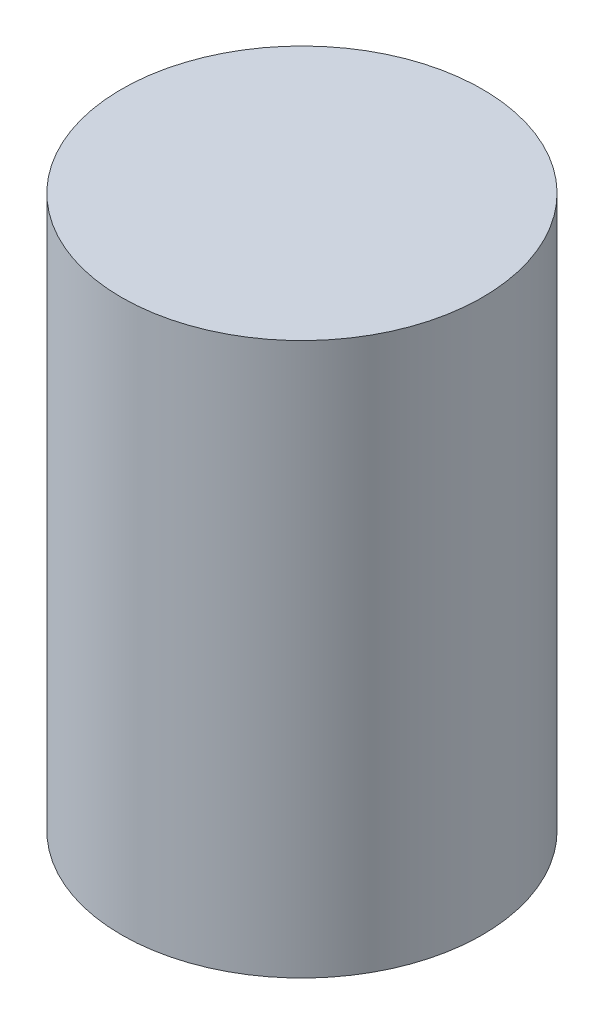
ISO-10303-21;
HEADER;
FILE_DESCRIPTION(('STEP AP214'),'2;1');
FILE_NAME('part.step','',(''),(''),'','','');
FILE_SCHEMA(('AUTOMOTIVE_DESIGN { 1 0 10303 214 1 1 1 1 }'));
ENDSEC;
DATA;
#1=APPLICATION_CONTEXT('core data for automotive mechanical design processes');
#2=APPLICATION_PROTOCOL_DEFINITION('international standard','automotive_design',2000,#1);
#3=PRODUCT_CONTEXT('',#1,'mechanical');
#4=PRODUCT('Part','Part','',(#3));
#5=PRODUCT_RELATED_PRODUCT_CATEGORY('part','',(#4));
#6=PRODUCT_DEFINITION_FORMATION('','',#4);
#7=PRODUCT_DEFINITION_CONTEXT('part definition',#1,'design');
#8=PRODUCT_DEFINITION('design','',#6,#7);
#9=PRODUCT_DEFINITION_SHAPE('','',#8);
#10=(LENGTH_UNIT() NAMED_UNIT(*) SI_UNIT(.MILLI.,.METRE.));
#11=(NAMED_UNIT(*) PLANE_ANGLE_UNIT() SI_UNIT($,.RADIAN.));
#12=(NAMED_UNIT(*) SI_UNIT($,.STERADIAN.) SOLID_ANGLE_UNIT());
#13=UNCERTAINTY_MEASURE_WITH_UNIT(LENGTH_MEASURE(1.E-05),#10,'distance_accuracy_value','');
#14=(GEOMETRIC_REPRESENTATION_CONTEXT(3) GLOBAL_UNCERTAINTY_ASSIGNED_CONTEXT((#13)) GLOBAL_UNIT_ASSIGNED_CONTEXT((#10,
#11,#12)) REPRESENTATION_CONTEXT('',''));
#15=CARTESIAN_POINT('',(0.,0.,0.));
#16=DIRECTION('',(0.,0.,1.));
#17=DIRECTION('',(1.,0.,0.));
#18=AXIS2_PLACEMENT_3D('',#15,#16,#17);
#19=CARTESIAN_POINT('',(0.,14.,0.));
#20=DIRECTION('',(0.,1.,0.));
#21=DIRECTION('',(0.,0.,1.));
#22=AXIS2_PLACEMENT_3D('',#19,#20,#21);
#23=PLANE('',#22);
#24=CARTESIAN_POINT('',(0.,14.,0.));
#25=DIRECTION('',(0.,1.,0.));
#26=DIRECTION('',(0.,0.,1.));
#27=AXIS2_PLACEMENT_3D('',#24,#25,#26);
#28=CIRCLE('',#27,4.575);
#29=CARTESIAN_POINT('',(0.,14.,4.575));
#30=VERTEX_POINT('',#29);
#31=EDGE_CURVE('E50',#30,#30,#28,.T.);
#32=ORIENTED_EDGE('',*,*,#31,.T.);
#33=EDGE_LOOP('',(#32));
#34=FACE_BOUND('',#33,.T.);
#35=ADVANCED_FACE('F43',(#34),#23,.T.);
#36=CARTESIAN_POINT('',(0.,-16.,0.));
#37=DIRECTION('',(0.,1.,0.));
#38=DIRECTION('',(0.,0.,1.));
#39=AXIS2_PLACEMENT_3D('',#36,#37,#38);
#40=CYLINDRICAL_SURFACE('',#39,4.575);
#41=ORIENTED_EDGE('',*,*,#31,.F.);
#42=EDGE_LOOP('',(#41));
#43=FACE_BOUND('',#42,.T.);
#44=CARTESIAN_POINT('',(0.,0.,0.));
#45=DIRECTION('',(0.,1.,0.));
#46=DIRECTION('',(0.,0.,1.));
#47=AXIS2_PLACEMENT_3D('',#44,#45,#46);
#48=CIRCLE('',#47,4.575);
#49=CARTESIAN_POINT('',(0.,0.,4.575));
#50=VERTEX_POINT('',#49);
#51=EDGE_CURVE('E11',#50,#50,#48,.T.);
#52=ORIENTED_EDGE('',*,*,#51,.T.);
#53=EDGE_LOOP('',(#52));
#54=FACE_BOUND('',#53,.T.);
#55=ADVANCED_FACE('F57',(#43,#54),#40,.T.);
#56=CARTESIAN_POINT('',(0.,0.,0.));
#57=DIRECTION('',(0.,1.,0.));
#58=DIRECTION('',(0.,0.,1.));
#59=AXIS2_PLACEMENT_3D('',#56,#57,#58);
#60=PLANE('',#59);
#61=ORIENTED_EDGE('',*,*,#51,.F.);
#62=EDGE_LOOP('',(#61));
#63=FACE_BOUND('',#62,.T.);
#64=ADVANCED_FACE('F45',(#63),#60,.F.);
#65=CLOSED_SHELL('',(#35,#55,#64));
#66=MANIFOLD_SOLID_BREP('B2',#65);
#67=ADVANCED_BREP_SHAPE_REPRESENTATION('',(#18,#66),#14);
#68=SHAPE_DEFINITION_REPRESENTATION(#9,#67);
ENDSEC;
END-ISO-10303-21;
